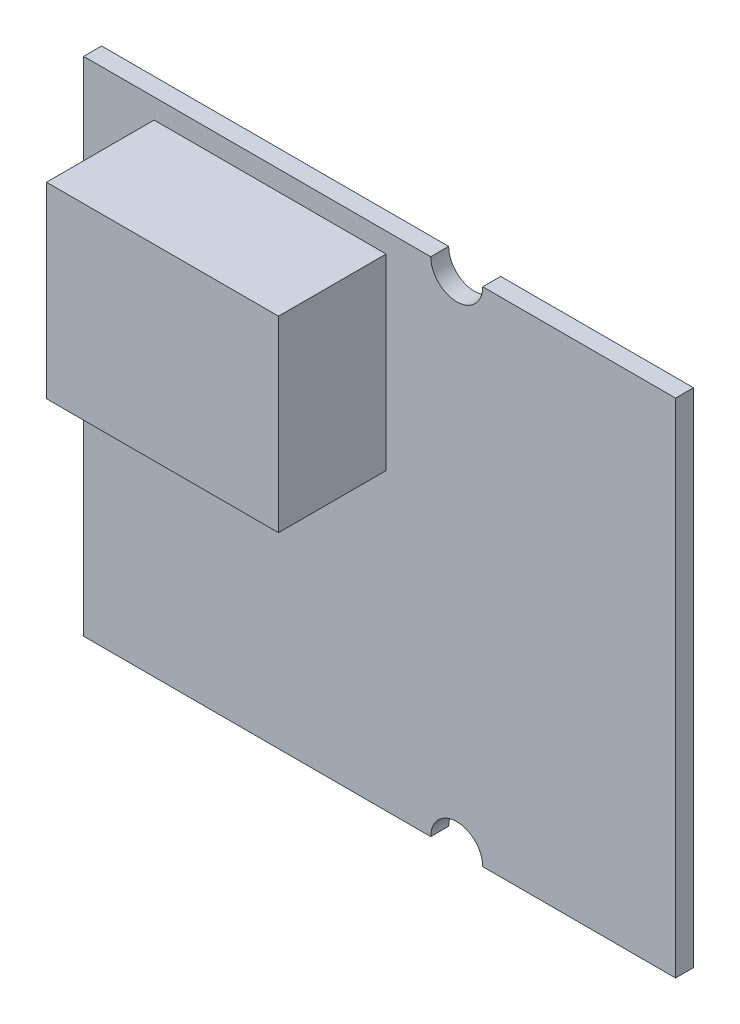
ISO-10303-21;
HEADER;
FILE_DESCRIPTION(('STEP AP214'),'2;1');
FILE_NAME('part.step','',(''),(''),'','','');
FILE_SCHEMA(('AUTOMOTIVE_DESIGN { 1 0 10303 214 1 1 1 1 }'));
ENDSEC;
DATA;
#1=APPLICATION_CONTEXT('core data for automotive mechanical design processes');
#2=APPLICATION_PROTOCOL_DEFINITION('international standard','automotive_design',2000,#1);
#3=PRODUCT_CONTEXT('',#1,'mechanical');
#4=PRODUCT('Part','Part','',(#3));
#5=PRODUCT_RELATED_PRODUCT_CATEGORY('part','',(#4));
#6=PRODUCT_DEFINITION_FORMATION('','',#4);
#7=PRODUCT_DEFINITION_CONTEXT('part definition',#1,'design');
#8=PRODUCT_DEFINITION('design','',#6,#7);
#9=PRODUCT_DEFINITION_SHAPE('','',#8);
#10=(LENGTH_UNIT() NAMED_UNIT(*) SI_UNIT(.MILLI.,.METRE.));
#11=(NAMED_UNIT(*) PLANE_ANGLE_UNIT() SI_UNIT($,.RADIAN.));
#12=(NAMED_UNIT(*) SI_UNIT($,.STERADIAN.) SOLID_ANGLE_UNIT());
#13=UNCERTAINTY_MEASURE_WITH_UNIT(LENGTH_MEASURE(1.E-05),#10,'distance_accuracy_value','');
#14=(GEOMETRIC_REPRESENTATION_CONTEXT(3) GLOBAL_UNCERTAINTY_ASSIGNED_CONTEXT((#13)) GLOBAL_UNIT_ASSIGNED_CONTEXT((#10,
#11,#12)) REPRESENTATION_CONTEXT('',''));
#15=CARTESIAN_POINT('',(0.,0.,0.));
#16=DIRECTION('',(0.,0.,1.));
#17=DIRECTION('',(1.,0.,0.));
#18=AXIS2_PLACEMENT_3D('',#15,#16,#17);
#19=CARTESIAN_POINT('',(0.,14.,1.));
#20=DIRECTION('',(0.,0.,1.));
#21=DIRECTION('',(1.,0.,0.));
#22=AXIS2_PLACEMENT_3D('',#19,#20,#21);
#23=PLANE('',#22);
#24=DIRECTION('',(0.,-1.,0.));
#25=VECTOR('',#24,1.);
#26=CARTESIAN_POINT('',(0.,0.,1.));
#27=LINE('',#26,#25);
#28=CARTESIAN_POINT('',(0.,12.55,1.));
#29=VERTEX_POINT('',#28);
#30=CARTESIAN_POINT('',(0.,0.,1.));
#31=VERTEX_POINT('',#30);
#32=EDGE_CURVE('E207',#29,#31,#27,.T.);
#33=ORIENTED_EDGE('',*,*,#32,.T.);
#34=DIRECTION('',(1.,0.,0.));
#35=VECTOR('',#34,1.);
#36=CARTESIAN_POINT('',(0.,0.,1.));
#37=LINE('',#36,#35);
#38=CARTESIAN_POINT('',(19.35,0.,1.));
#39=VERTEX_POINT('',#38);
#40=EDGE_CURVE('E123',#31,#39,#37,.T.);
#41=ORIENTED_EDGE('',*,*,#40,.T.);
#42=CARTESIAN_POINT('',(20.8,0.,1.));
#43=DIRECTION('',(0.,0.,-1.));
#44=DIRECTION('',(1.,0.,0.));
#45=AXIS2_PLACEMENT_3D('',#42,#43,#44);
#46=CIRCLE('',#45,1.45);
#47=CARTESIAN_POINT('',(22.25,0.,1.));
#48=VERTEX_POINT('',#47);
#49=EDGE_CURVE('E236',#39,#48,#46,.T.);
#50=ORIENTED_EDGE('',*,*,#49,.T.);
#51=DIRECTION('',(1.,0.,0.));
#52=VECTOR('',#51,1.);
#53=CARTESIAN_POINT('',(22.25,0.,1.));
#54=LINE('',#53,#52);
#55=CARTESIAN_POINT('',(33.,0.,1.));
#56=VERTEX_POINT('',#55);
#57=EDGE_CURVE('E255',#48,#56,#54,.T.);
#58=ORIENTED_EDGE('',*,*,#57,.T.);
#59=DIRECTION('',(0.,1.,0.));
#60=VECTOR('',#59,1.);
#61=CARTESIAN_POINT('',(33.,0.,1.));
#62=LINE('',#61,#60);
#63=CARTESIAN_POINT('',(33.,28.,1.));
#64=VERTEX_POINT('',#63);
#65=EDGE_CURVE('E251',#56,#64,#62,.T.);
#66=ORIENTED_EDGE('',*,*,#65,.T.);
#67=DIRECTION('',(-1.,0.,0.));
#68=VECTOR('',#67,1.);
#69=CARTESIAN_POINT('',(22.25,28.,1.));
#70=LINE('',#69,#68);
#71=CARTESIAN_POINT('',(22.25,28.,1.));
#72=VERTEX_POINT('',#71);
#73=EDGE_CURVE('E254',#64,#72,#70,.T.);
#74=ORIENTED_EDGE('',*,*,#73,.T.);
#75=CARTESIAN_POINT('',(20.8,28.,1.));
#76=DIRECTION('',(0.,0.,-1.));
#77=DIRECTION('',(1.,0.,0.));
#78=AXIS2_PLACEMENT_3D('',#75,#76,#77);
#79=CIRCLE('',#78,1.45);
#80=CARTESIAN_POINT('',(19.35,28.,1.));
#81=VERTEX_POINT('',#80);
#82=EDGE_CURVE('E152',#72,#81,#79,.T.);
#83=ORIENTED_EDGE('',*,*,#82,.T.);
#84=DIRECTION('',(-1.,0.,0.));
#85=VECTOR('',#84,1.);
#86=CARTESIAN_POINT('',(0.,28.,1.));
#87=LINE('',#86,#85);
#88=CARTESIAN_POINT('',(0.,28.,1.));
#89=VERTEX_POINT('',#88);
#90=EDGE_CURVE('E145',#81,#89,#87,.T.);
#91=ORIENTED_EDGE('',*,*,#90,.T.);
#92=DIRECTION('',(0.,-1.,0.));
#93=VECTOR('',#92,1.);
#94=CARTESIAN_POINT('',(0.,15.45,1.));
#95=LINE('',#94,#93);
#96=CARTESIAN_POINT('',(0.,15.45,1.));
#97=VERTEX_POINT('',#96);
#98=EDGE_CURVE('E149',#89,#97,#95,.T.);
#99=ORIENTED_EDGE('',*,*,#98,.T.);
#100=CARTESIAN_POINT('',(0.,14.,1.));
#101=DIRECTION('',(0.,0.,-1.));
#102=DIRECTION('',(1.,0.,0.));
#103=AXIS2_PLACEMENT_3D('',#100,#101,#102);
#104=CIRCLE('',#103,1.45);
#105=EDGE_CURVE('E76',#97,#29,#104,.T.);
#106=ORIENTED_EDGE('',*,*,#105,.T.);
#107=EDGE_LOOP('',(#33,#41,#50,#58,#66,#74,#83,#91,#99,#106));
#108=FACE_BOUND('',#107,.T.);
#109=DIRECTION('',(1.,0.,0.));
#110=VECTOR('',#109,1.);
#111=CARTESIAN_POINT('',(3.92775803099243,16.4328938959886,1.));
#112=LINE('',#111,#110);
#113=CARTESIAN_POINT('',(3.92775803099243,16.4328938959886,1.));
#114=VERTEX_POINT('',#113);
#115=CARTESIAN_POINT('',(16.863278053947,16.4328938959886,1.));
#116=VERTEX_POINT('',#115);
#117=EDGE_CURVE('E290',#114,#116,#112,.T.);
#118=ORIENTED_EDGE('',*,*,#117,.F.);
#119=DIRECTION('',(0.,-1.,0.));
#120=VECTOR('',#119,1.);
#121=CARTESIAN_POINT('',(3.92775803099243,26.8876292570067,1.));
#122=LINE('',#121,#120);
#123=CARTESIAN_POINT('',(3.92775803099243,26.8876292570067,1.));
#124=VERTEX_POINT('',#123);
#125=EDGE_CURVE('E294',#124,#114,#122,.T.);
#126=ORIENTED_EDGE('',*,*,#125,.F.);
#127=DIRECTION('',(-1.,0.,0.));
#128=VECTOR('',#127,1.);
#129=CARTESIAN_POINT('',(3.92775803099243,26.8876292570067,1.));
#130=LINE('',#129,#128);
#131=CARTESIAN_POINT('',(16.863278053947,26.8876292570067,1.));
#132=VERTEX_POINT('',#131);
#133=EDGE_CURVE('E283',#132,#124,#130,.T.);
#134=ORIENTED_EDGE('',*,*,#133,.F.);
#135=DIRECTION('',(0.,1.,0.));
#136=VECTOR('',#135,1.);
#137=CARTESIAN_POINT('',(16.863278053947,26.8876292570067,1.));
#138=LINE('',#137,#136);
#139=EDGE_CURVE('E287',#116,#132,#138,.T.);
#140=ORIENTED_EDGE('',*,*,#139,.F.);
#141=EDGE_LOOP('',(#118,#126,#134,#140));
#142=FACE_BOUND('',#141,.T.);
#143=ADVANCED_FACE('F51',(#108,#142),#23,.T.);
#144=CARTESIAN_POINT('',(0.,0.,1.));
#145=DIRECTION('',(1.,0.,0.));
#146=DIRECTION('',(0.,1.,0.));
#147=AXIS2_PLACEMENT_3D('',#144,#145,#146);
#148=PLANE('',#147);
#149=DIRECTION('',(0.,-1.,0.));
#150=VECTOR('',#149,1.);
#151=CARTESIAN_POINT('',(0.,0.,0.));
#152=LINE('',#151,#150);
#153=CARTESIAN_POINT('',(0.,12.55,0.));
#154=VERTEX_POINT('',#153);
#155=CARTESIAN_POINT('',(0.,0.,0.));
#156=VERTEX_POINT('',#155);
#157=EDGE_CURVE('E177',#154,#156,#152,.T.);
#158=ORIENTED_EDGE('',*,*,#157,.T.);
#159=DIRECTION('',(0.,0.,-1.));
#160=VECTOR('',#159,1.);
#161=CARTESIAN_POINT('',(0.,0.,1.));
#162=LINE('',#161,#160);
#163=EDGE_CURVE('E11',#31,#156,#162,.T.);
#164=ORIENTED_EDGE('',*,*,#163,.F.);
#165=ORIENTED_EDGE('',*,*,#32,.F.);
#166=DIRECTION('',(0.,0.,-1.));
#167=VECTOR('',#166,1.);
#168=CARTESIAN_POINT('',(0.,12.55,1.));
#169=LINE('',#168,#167);
#170=EDGE_CURVE('E173',#29,#154,#169,.T.);
#171=ORIENTED_EDGE('',*,*,#170,.T.);
#172=EDGE_LOOP('',(#158,#164,#165,#171));
#173=FACE_BOUND('',#172,.T.);
#174=ADVANCED_FACE('F53',(#173),#148,.F.);
#175=CARTESIAN_POINT('',(0.,0.,1.));
#176=DIRECTION('',(0.,1.,0.));
#177=DIRECTION('',(0.,0.,1.));
#178=AXIS2_PLACEMENT_3D('',#175,#176,#177);
#179=PLANE('',#178);
#180=DIRECTION('',(1.,0.,0.));
#181=VECTOR('',#180,1.);
#182=CARTESIAN_POINT('',(0.,0.,0.));
#183=LINE('',#182,#181);
#184=CARTESIAN_POINT('',(19.35,0.,0.));
#185=VERTEX_POINT('',#184);
#186=EDGE_CURVE('E181',#156,#185,#183,.T.);
#187=ORIENTED_EDGE('',*,*,#186,.T.);
#188=DIRECTION('',(0.,0.,-1.));
#189=VECTOR('',#188,1.);
#190=CARTESIAN_POINT('',(19.35,0.,1.));
#191=LINE('',#190,#189);
#192=EDGE_CURVE('E60',#39,#185,#191,.T.);
#193=ORIENTED_EDGE('',*,*,#192,.F.);
#194=ORIENTED_EDGE('',*,*,#40,.F.);
#195=ORIENTED_EDGE('',*,*,#163,.T.);
#196=EDGE_LOOP('',(#187,#193,#194,#195));
#197=FACE_BOUND('',#196,.T.);
#198=ADVANCED_FACE('F347',(#197),#179,.F.);
#199=CARTESIAN_POINT('',(20.8,0.,1.));
#200=DIRECTION('',(0.,0.,-1.));
#201=DIRECTION('',(-1.,0.,0.));
#202=AXIS2_PLACEMENT_3D('',#199,#200,#201);
#203=CYLINDRICAL_SURFACE('',#202,1.45);
#204=CARTESIAN_POINT('',(20.8,0.,0.));
#205=DIRECTION('',(0.,0.,-1.));
#206=DIRECTION('',(1.,0.,0.));
#207=AXIS2_PLACEMENT_3D('',#204,#205,#206);
#208=CIRCLE('',#207,1.45);
#209=CARTESIAN_POINT('',(22.25,0.,0.));
#210=VERTEX_POINT('',#209);
#211=EDGE_CURVE('E185',#185,#210,#208,.T.);
#212=ORIENTED_EDGE('',*,*,#211,.T.);
#213=DIRECTION('',(0.,0.,-1.));
#214=VECTOR('',#213,1.);
#215=CARTESIAN_POINT('',(22.25,0.,1.));
#216=LINE('',#215,#214);
#217=EDGE_CURVE('E226',#48,#210,#216,.T.);
#218=ORIENTED_EDGE('',*,*,#217,.F.);
#219=ORIENTED_EDGE('',*,*,#49,.F.);
#220=ORIENTED_EDGE('',*,*,#192,.T.);
#221=EDGE_LOOP('',(#212,#218,#219,#220));
#222=FACE_BOUND('',#221,.T.);
#223=ADVANCED_FACE('F234',(#222),#203,.F.);
#224=CARTESIAN_POINT('',(22.25,0.,1.));
#225=DIRECTION('',(0.,1.,0.));
#226=DIRECTION('',(0.,0.,1.));
#227=AXIS2_PLACEMENT_3D('',#224,#225,#226);
#228=PLANE('',#227);
#229=DIRECTION('',(1.,0.,0.));
#230=VECTOR('',#229,1.);
#231=CARTESIAN_POINT('',(22.25,0.,0.));
#232=LINE('',#231,#230);
#233=CARTESIAN_POINT('',(33.,0.,0.));
#234=VERTEX_POINT('',#233);
#235=EDGE_CURVE('E188',#210,#234,#232,.T.);
#236=ORIENTED_EDGE('',*,*,#235,.T.);
#237=DIRECTION('',(0.,0.,-1.));
#238=VECTOR('',#237,1.);
#239=CARTESIAN_POINT('',(33.,0.,1.));
#240=LINE('',#239,#238);
#241=EDGE_CURVE('E222',#56,#234,#240,.T.);
#242=ORIENTED_EDGE('',*,*,#241,.F.);
#243=ORIENTED_EDGE('',*,*,#57,.F.);
#244=ORIENTED_EDGE('',*,*,#217,.T.);
#245=EDGE_LOOP('',(#236,#242,#243,#244));
#246=FACE_BOUND('',#245,.T.);
#247=ADVANCED_FACE('F245',(#246),#228,.F.);
#248=CARTESIAN_POINT('',(33.,0.,1.));
#249=DIRECTION('',(-1.,0.,0.));
#250=DIRECTION('',(0.,-1.,0.));
#251=AXIS2_PLACEMENT_3D('',#248,#249,#250);
#252=PLANE('',#251);
#253=DIRECTION('',(0.,1.,0.));
#254=VECTOR('',#253,1.);
#255=CARTESIAN_POINT('',(33.,0.,0.));
#256=LINE('',#255,#254);
#257=CARTESIAN_POINT('',(33.,28.,0.));
#258=VERTEX_POINT('',#257);
#259=EDGE_CURVE('E191',#234,#258,#256,.T.);
#260=ORIENTED_EDGE('',*,*,#259,.T.);
#261=DIRECTION('',(0.,0.,-1.));
#262=VECTOR('',#261,1.);
#263=CARTESIAN_POINT('',(33.,28.,1.));
#264=LINE('',#263,#262);
#265=EDGE_CURVE('E218',#64,#258,#264,.T.);
#266=ORIENTED_EDGE('',*,*,#265,.F.);
#267=ORIENTED_EDGE('',*,*,#65,.F.);
#268=ORIENTED_EDGE('',*,*,#241,.T.);
#269=EDGE_LOOP('',(#260,#266,#267,#268));
#270=FACE_BOUND('',#269,.T.);
#271=ADVANCED_FACE('F249',(#270),#252,.F.);
#272=CARTESIAN_POINT('',(22.25,28.,1.));
#273=DIRECTION('',(0.,-1.,0.));
#274=DIRECTION('',(0.,0.,-1.));
#275=AXIS2_PLACEMENT_3D('',#272,#273,#274);
#276=PLANE('',#275);
#277=DIRECTION('',(-1.,0.,0.));
#278=VECTOR('',#277,1.);
#279=CARTESIAN_POINT('',(22.25,28.,0.));
#280=LINE('',#279,#278);
#281=CARTESIAN_POINT('',(22.25,28.,0.));
#282=VERTEX_POINT('',#281);
#283=EDGE_CURVE('E194',#258,#282,#280,.T.);
#284=ORIENTED_EDGE('',*,*,#283,.T.);
#285=DIRECTION('',(0.,0.,-1.));
#286=VECTOR('',#285,1.);
#287=CARTESIAN_POINT('',(22.25,28.,1.));
#288=LINE('',#287,#286);
#289=EDGE_CURVE('E214',#72,#282,#288,.T.);
#290=ORIENTED_EDGE('',*,*,#289,.F.);
#291=ORIENTED_EDGE('',*,*,#73,.F.);
#292=ORIENTED_EDGE('',*,*,#265,.T.);
#293=EDGE_LOOP('',(#284,#290,#291,#292));
#294=FACE_BOUND('',#293,.T.);
#295=ADVANCED_FACE('F363',(#294),#276,.F.);
#296=CARTESIAN_POINT('',(20.8,28.,1.));
#297=DIRECTION('',(0.,0.,-1.));
#298=DIRECTION('',(-1.,0.,0.));
#299=AXIS2_PLACEMENT_3D('',#296,#297,#298);
#300=CYLINDRICAL_SURFACE('',#299,1.45);
#301=CARTESIAN_POINT('',(20.8,28.,0.));
#302=DIRECTION('',(0.,0.,-1.));
#303=DIRECTION('',(1.,0.,0.));
#304=AXIS2_PLACEMENT_3D('',#301,#302,#303);
#305=CIRCLE('',#304,1.45);
#306=CARTESIAN_POINT('',(19.35,28.,0.));
#307=VERTEX_POINT('',#306);
#308=EDGE_CURVE('E197',#282,#307,#305,.T.);
#309=ORIENTED_EDGE('',*,*,#308,.T.);
#310=DIRECTION('',(0.,0.,-1.));
#311=VECTOR('',#310,1.);
#312=CARTESIAN_POINT('',(19.35,28.,1.));
#313=LINE('',#312,#311);
#314=EDGE_CURVE('E166',#81,#307,#313,.T.);
#315=ORIENTED_EDGE('',*,*,#314,.F.);
#316=ORIENTED_EDGE('',*,*,#82,.F.);
#317=ORIENTED_EDGE('',*,*,#289,.T.);
#318=EDGE_LOOP('',(#309,#315,#316,#317));
#319=FACE_BOUND('',#318,.T.);
#320=ADVANCED_FACE('F360',(#319),#300,.F.);
#321=CARTESIAN_POINT('',(0.,28.,1.));
#322=DIRECTION('',(0.,-1.,0.));
#323=DIRECTION('',(0.,0.,-1.));
#324=AXIS2_PLACEMENT_3D('',#321,#322,#323);
#325=PLANE('',#324);
#326=DIRECTION('',(-1.,0.,0.));
#327=VECTOR('',#326,1.);
#328=CARTESIAN_POINT('',(0.,28.,0.));
#329=LINE('',#328,#327);
#330=CARTESIAN_POINT('',(0.,28.,0.));
#331=VERTEX_POINT('',#330);
#332=EDGE_CURVE('E162',#307,#331,#329,.T.);
#333=ORIENTED_EDGE('',*,*,#332,.T.);
#334=DIRECTION('',(0.,0.,-1.));
#335=VECTOR('',#334,1.);
#336=CARTESIAN_POINT('',(0.,28.,1.));
#337=LINE('',#336,#335);
#338=EDGE_CURVE('E159',#89,#331,#337,.T.);
#339=ORIENTED_EDGE('',*,*,#338,.F.);
#340=ORIENTED_EDGE('',*,*,#90,.F.);
#341=ORIENTED_EDGE('',*,*,#314,.T.);
#342=EDGE_LOOP('',(#333,#339,#340,#341));
#343=FACE_BOUND('',#342,.T.);
#344=ADVANCED_FACE('F160',(#343),#325,.F.);
#345=CARTESIAN_POINT('',(0.,15.45,1.));
#346=DIRECTION('',(1.,0.,0.));
#347=DIRECTION('',(0.,1.,0.));
#348=AXIS2_PLACEMENT_3D('',#345,#346,#347);
#349=PLANE('',#348);
#350=DIRECTION('',(0.,-1.,0.));
#351=VECTOR('',#350,1.);
#352=CARTESIAN_POINT('',(0.,15.45,0.));
#353=LINE('',#352,#351);
#354=CARTESIAN_POINT('',(0.,15.45,0.));
#355=VERTEX_POINT('',#354);
#356=EDGE_CURVE('E202',#331,#355,#353,.T.);
#357=ORIENTED_EDGE('',*,*,#356,.T.);
#358=DIRECTION('',(0.,0.,-1.));
#359=VECTOR('',#358,1.);
#360=CARTESIAN_POINT('',(0.,15.45,1.));
#361=LINE('',#360,#359);
#362=EDGE_CURVE('E167',#97,#355,#361,.T.);
#363=ORIENTED_EDGE('',*,*,#362,.F.);
#364=ORIENTED_EDGE('',*,*,#98,.F.);
#365=ORIENTED_EDGE('',*,*,#338,.T.);
#366=EDGE_LOOP('',(#357,#363,#364,#365));
#367=FACE_BOUND('',#366,.T.);
#368=ADVANCED_FACE('F169',(#367),#349,.F.);
#369=CARTESIAN_POINT('',(0.,14.,1.));
#370=DIRECTION('',(0.,0.,-1.));
#371=DIRECTION('',(-1.,0.,0.));
#372=AXIS2_PLACEMENT_3D('',#369,#370,#371);
#373=CYLINDRICAL_SURFACE('',#372,1.45);
#374=CARTESIAN_POINT('',(0.,14.,0.));
#375=DIRECTION('',(0.,0.,-1.));
#376=DIRECTION('',(1.,0.,0.));
#377=AXIS2_PLACEMENT_3D('',#374,#375,#376);
#378=CIRCLE('',#377,1.45);
#379=EDGE_CURVE('E115',#355,#154,#378,.T.);
#380=ORIENTED_EDGE('',*,*,#379,.T.);
#381=ORIENTED_EDGE('',*,*,#170,.F.);
#382=ORIENTED_EDGE('',*,*,#105,.F.);
#383=ORIENTED_EDGE('',*,*,#362,.T.);
#384=EDGE_LOOP('',(#380,#381,#382,#383));
#385=FACE_BOUND('',#384,.T.);
#386=ADVANCED_FACE('F353',(#385),#373,.F.);
#387=CARTESIAN_POINT('',(0.,14.,0.));
#388=DIRECTION('',(0.,0.,1.));
#389=DIRECTION('',(1.,0.,0.));
#390=AXIS2_PLACEMENT_3D('',#387,#388,#389);
#391=PLANE('',#390);
#392=ORIENTED_EDGE('',*,*,#157,.F.);
#393=ORIENTED_EDGE('',*,*,#379,.F.);
#394=ORIENTED_EDGE('',*,*,#356,.F.);
#395=ORIENTED_EDGE('',*,*,#332,.F.);
#396=ORIENTED_EDGE('',*,*,#308,.F.);
#397=ORIENTED_EDGE('',*,*,#283,.F.);
#398=ORIENTED_EDGE('',*,*,#259,.F.);
#399=ORIENTED_EDGE('',*,*,#235,.F.);
#400=ORIENTED_EDGE('',*,*,#211,.F.);
#401=ORIENTED_EDGE('',*,*,#186,.F.);
#402=EDGE_LOOP('',(#392,#393,#394,#395,#396,#397,#398,#399,#400,#401));
#403=FACE_BOUND('',#402,.T.);
#404=ADVANCED_FACE('F240',(#403),#391,.F.);
#405=CARTESIAN_POINT('',(3.92775803099243,26.8876292570067,7.));
#406=DIRECTION('',(1.,0.,0.));
#407=DIRECTION('',(0.,0.,-1.));
#408=AXIS2_PLACEMENT_3D('',#405,#406,#407);
#409=PLANE('',#408);
#410=ORIENTED_EDGE('',*,*,#125,.T.);
#411=DIRECTION('',(0.,0.,-1.));
#412=VECTOR('',#411,1.);
#413=CARTESIAN_POINT('',(3.92775803099243,16.4328938959886,7.));
#414=LINE('',#413,#412);
#415=CARTESIAN_POINT('',(3.92775803099243,16.4328938959886,7.));
#416=VERTEX_POINT('',#415);
#417=EDGE_CURVE('E182',#416,#114,#414,.T.);
#418=ORIENTED_EDGE('',*,*,#417,.F.);
#419=DIRECTION('',(0.,-1.,0.));
#420=VECTOR('',#419,1.);
#421=CARTESIAN_POINT('',(3.92775803099243,26.8876292570067,7.));
#422=LINE('',#421,#420);
#423=CARTESIAN_POINT('',(3.92775803099243,26.8876292570067,7.));
#424=VERTEX_POINT('',#423);
#425=EDGE_CURVE('E286',#424,#416,#422,.T.);
#426=ORIENTED_EDGE('',*,*,#425,.F.);
#427=DIRECTION('',(0.,0.,-1.));
#428=VECTOR('',#427,1.);
#429=CARTESIAN_POINT('',(3.92775803099243,26.8876292570067,7.));
#430=LINE('',#429,#428);
#431=EDGE_CURVE('E278',#424,#124,#430,.T.);
#432=ORIENTED_EDGE('',*,*,#431,.T.);
#433=EDGE_LOOP('',(#410,#418,#426,#432));
#434=FACE_BOUND('',#433,.T.);
#435=ADVANCED_FACE('F322',(#434),#409,.F.);
#436=CARTESIAN_POINT('',(3.92775803099243,16.4328938959886,7.));
#437=DIRECTION('',(0.,1.,0.));
#438=DIRECTION('',(0.,0.,1.));
#439=AXIS2_PLACEMENT_3D('',#436,#437,#438);
#440=PLANE('',#439);
#441=ORIENTED_EDGE('',*,*,#117,.T.);
#442=DIRECTION('',(0.,0.,-1.));
#443=VECTOR('',#442,1.);
#444=CARTESIAN_POINT('',(16.863278053947,16.4328938959886,7.));
#445=LINE('',#444,#443);
#446=CARTESIAN_POINT('',(16.863278053947,16.4328938959886,7.));
#447=VERTEX_POINT('',#446);
#448=EDGE_CURVE('E272',#447,#116,#445,.T.);
#449=ORIENTED_EDGE('',*,*,#448,.F.);
#450=DIRECTION('',(1.,0.,0.));
#451=VECTOR('',#450,1.);
#452=CARTESIAN_POINT('',(3.92775803099243,16.4328938959886,7.));
#453=LINE('',#452,#451);
#454=EDGE_CURVE('E305',#416,#447,#453,.T.);
#455=ORIENTED_EDGE('',*,*,#454,.F.);
#456=ORIENTED_EDGE('',*,*,#417,.T.);
#457=EDGE_LOOP('',(#441,#449,#455,#456));
#458=FACE_BOUND('',#457,.T.);
#459=ADVANCED_FACE('F327',(#458),#440,.F.);
#460=CARTESIAN_POINT('',(16.863278053947,26.8876292570067,7.));
#461=DIRECTION('',(-1.,0.,0.));
#462=DIRECTION('',(0.,0.,1.));
#463=AXIS2_PLACEMENT_3D('',#460,#461,#462);
#464=PLANE('',#463);
#465=ORIENTED_EDGE('',*,*,#139,.T.);
#466=DIRECTION('',(0.,0.,-1.));
#467=VECTOR('',#466,1.);
#468=CARTESIAN_POINT('',(16.863278053947,26.8876292570067,7.));
#469=LINE('',#468,#467);
#470=CARTESIAN_POINT('',(16.863278053947,26.8876292570067,7.));
#471=VERTEX_POINT('',#470);
#472=EDGE_CURVE('E67',#471,#132,#469,.T.);
#473=ORIENTED_EDGE('',*,*,#472,.F.);
#474=DIRECTION('',(0.,1.,0.));
#475=VECTOR('',#474,1.);
#476=CARTESIAN_POINT('',(16.863278053947,26.8876292570067,7.));
#477=LINE('',#476,#475);
#478=EDGE_CURVE('E301',#447,#471,#477,.T.);
#479=ORIENTED_EDGE('',*,*,#478,.F.);
#480=ORIENTED_EDGE('',*,*,#448,.T.);
#481=EDGE_LOOP('',(#465,#473,#479,#480));
#482=FACE_BOUND('',#481,.T.);
#483=ADVANCED_FACE('F336',(#482),#464,.F.);
#484=CARTESIAN_POINT('',(3.92775803099243,26.8876292570067,7.));
#485=DIRECTION('',(0.,-1.,0.));
#486=DIRECTION('',(0.,0.,-1.));
#487=AXIS2_PLACEMENT_3D('',#484,#485,#486);
#488=PLANE('',#487);
#489=ORIENTED_EDGE('',*,*,#133,.T.);
#490=ORIENTED_EDGE('',*,*,#431,.F.);
#491=DIRECTION('',(-1.,0.,0.));
#492=VECTOR('',#491,1.);
#493=CARTESIAN_POINT('',(3.92775803099243,26.8876292570067,7.));
#494=LINE('',#493,#492);
#495=EDGE_CURVE('E282',#471,#424,#494,.T.);
#496=ORIENTED_EDGE('',*,*,#495,.F.);
#497=ORIENTED_EDGE('',*,*,#472,.T.);
#498=EDGE_LOOP('',(#489,#490,#496,#497));
#499=FACE_BOUND('',#498,.T.);
#500=ADVANCED_FACE('F339',(#499),#488,.F.);
#501=CARTESIAN_POINT('',(0.,0.,7.));
#502=DIRECTION('',(0.,0.,1.));
#503=DIRECTION('',(1.,0.,0.));
#504=AXIS2_PLACEMENT_3D('',#501,#502,#503);
#505=PLANE('',#504);
#506=ORIENTED_EDGE('',*,*,#425,.T.);
#507=ORIENTED_EDGE('',*,*,#454,.T.);
#508=ORIENTED_EDGE('',*,*,#478,.T.);
#509=ORIENTED_EDGE('',*,*,#495,.T.);
#510=EDGE_LOOP('',(#506,#507,#508,#509));
#511=FACE_BOUND('',#510,.T.);
#512=ADVANCED_FACE('F315',(#511),#505,.T.);
#513=CLOSED_SHELL('',(#143,#174,#198,#223,#247,#271,#295,#320,#344,#368,#386,#404,#435,#459,
#483,#500,#512));
#514=MANIFOLD_SOLID_BREP('B2',#513);
#515=ADVANCED_BREP_SHAPE_REPRESENTATION('',(#18,#514),#14);
#516=SHAPE_DEFINITION_REPRESENTATION(#9,#515);
ENDSEC;
END-ISO-10303-21;
